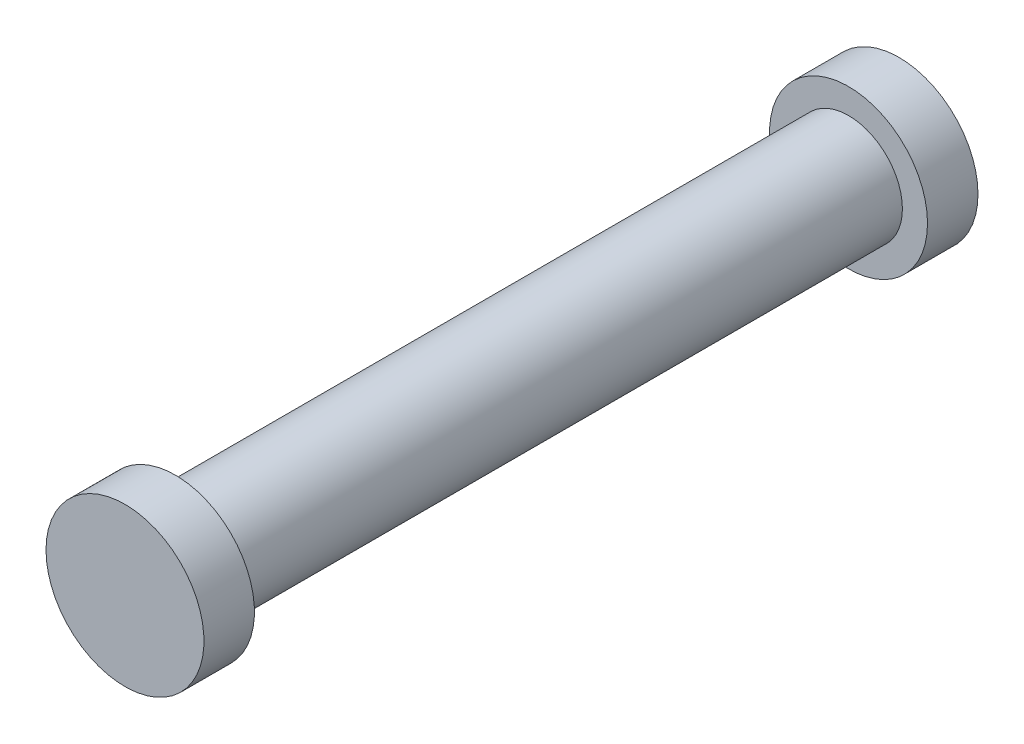
ISO-10303-21;
HEADER;
FILE_DESCRIPTION(('STEP AP214'),'2;1');
FILE_NAME('part.step','',(''),(''),'','','');
FILE_SCHEMA(('AUTOMOTIVE_DESIGN { 1 0 10303 214 1 1 1 1 }'));
ENDSEC;
DATA;
#1=APPLICATION_CONTEXT('core data for automotive mechanical design processes');
#2=APPLICATION_PROTOCOL_DEFINITION('international standard','automotive_design',2000,#1);
#3=PRODUCT_CONTEXT('',#1,'mechanical');
#4=PRODUCT('Part','Part','',(#3));
#5=PRODUCT_RELATED_PRODUCT_CATEGORY('part','',(#4));
#6=PRODUCT_DEFINITION_FORMATION('','',#4);
#7=PRODUCT_DEFINITION_CONTEXT('part definition',#1,'design');
#8=PRODUCT_DEFINITION('design','',#6,#7);
#9=PRODUCT_DEFINITION_SHAPE('','',#8);
#10=(LENGTH_UNIT() NAMED_UNIT(*) SI_UNIT(.MILLI.,.METRE.));
#11=(NAMED_UNIT(*) PLANE_ANGLE_UNIT() SI_UNIT($,.RADIAN.));
#12=(NAMED_UNIT(*) SI_UNIT($,.STERADIAN.) SOLID_ANGLE_UNIT());
#13=UNCERTAINTY_MEASURE_WITH_UNIT(LENGTH_MEASURE(1.E-05),#10,'distance_accuracy_value','');
#14=(GEOMETRIC_REPRESENTATION_CONTEXT(3) GLOBAL_UNCERTAINTY_ASSIGNED_CONTEXT((#13)) GLOBAL_UNIT_ASSIGNED_CONTEXT((#10,
#11,#12)) REPRESENTATION_CONTEXT('',''));
#15=CARTESIAN_POINT('',(0.,0.,0.));
#16=DIRECTION('',(0.,0.,1.));
#17=DIRECTION('',(1.,0.,0.));
#18=AXIS2_PLACEMENT_3D('',#15,#16,#17);
#19=CARTESIAN_POINT('',(0.,0.,50.8));
#20=DIRECTION('',(0.,0.,-1.));
#21=DIRECTION('',(-1.,0.,0.));
#22=AXIS2_PLACEMENT_3D('',#19,#20,#21);
#23=CYLINDRICAL_SURFACE('',#22,4.064);
#24=CARTESIAN_POINT('',(0.,0.,50.8));
#25=DIRECTION('',(0.,0.,1.));
#26=DIRECTION('',(1.,0.,0.));
#27=AXIS2_PLACEMENT_3D('',#24,#25,#26);
#28=CIRCLE('',#27,4.064);
#29=CARTESIAN_POINT('',(4.064,0.,50.8));
#30=VERTEX_POINT('',#29);
#31=EDGE_CURVE('E10',#30,#30,#28,.T.);
#32=ORIENTED_EDGE('',*,*,#31,.F.);
#33=EDGE_LOOP('',(#32));
#34=FACE_BOUND('',#33,.T.);
#35=CARTESIAN_POINT('',(0.,0.,0.));
#36=DIRECTION('',(0.,0.,1.));
#37=DIRECTION('',(1.,0.,0.));
#38=AXIS2_PLACEMENT_3D('',#35,#36,#37);
#39=CIRCLE('',#38,4.064);
#40=CARTESIAN_POINT('',(4.064,0.,0.));
#41=VERTEX_POINT('',#40);
#42=EDGE_CURVE('E46',#41,#41,#39,.T.);
#43=ORIENTED_EDGE('',*,*,#42,.T.);
#44=EDGE_LOOP('',(#43));
#45=FACE_BOUND('',#44,.T.);
#46=ADVANCED_FACE('F43',(#34,#45),#23,.T.);
#47=CARTESIAN_POINT('',(0.,0.,54.61));
#48=DIRECTION('',(0.,0.,-1.));
#49=DIRECTION('',(-1.,0.,0.));
#50=AXIS2_PLACEMENT_3D('',#47,#48,#49);
#51=CYLINDRICAL_SURFACE('',#50,5.96053579646076);
#52=CARTESIAN_POINT('',(0.,0.,54.61));
#53=DIRECTION('',(0.,0.,1.));
#54=DIRECTION('',(1.,0.,0.));
#55=AXIS2_PLACEMENT_3D('',#52,#53,#54);
#56=CIRCLE('',#55,5.96053579646076);
#57=CARTESIAN_POINT('',(-5.96053579646076,0.,54.61));
#58=VERTEX_POINT('',#57);
#59=EDGE_CURVE('E51',#58,#58,#56,.T.);
#60=CARTESIAN_POINT('',(0.,0.,50.8));
#61=DIRECTION('',(0.,0.,1.));
#62=DIRECTION('',(1.,0.,0.));
#63=AXIS2_PLACEMENT_3D('',#60,#61,#62);
#64=CIRCLE('',#63,5.96053579646076);
#65=CARTESIAN_POINT('',(-5.96053579646076,0.,50.8));
#66=VERTEX_POINT('',#65);
#67=EDGE_CURVE('E57',#66,#66,#64,.T.);
#68=CARTESIAN_POINT('',(-5.96053579646076,0.,54.61));
#69=CARTESIAN_POINT('',(-5.96053579646076,0.,54.5703125));
#70=CARTESIAN_POINT('',(-5.96053579646076,0.,54.530625));
#71=CARTESIAN_POINT('',(-5.96053579646076,0.,54.45125));
#72=CARTESIAN_POINT('',(-5.96053579646076,0.,54.4115625));
#73=CARTESIAN_POINT('',(-5.96053579646076,0.,54.3321875));
#74=CARTESIAN_POINT('',(-5.96053579646076,0.,54.2925));
#75=CARTESIAN_POINT('',(-5.96053579646076,0.,54.213125));
#76=CARTESIAN_POINT('',(-5.96053579646076,0.,54.1734375));
#77=CARTESIAN_POINT('',(-5.96053579646076,0.,54.0940625));
#78=CARTESIAN_POINT('',(-5.96053579646076,0.,54.054375));
#79=CARTESIAN_POINT('',(-5.96053579646076,0.,53.975));
#80=CARTESIAN_POINT('',(-5.96053579646076,0.,53.9353125));
#81=CARTESIAN_POINT('',(-5.96053579646076,0.,53.8559375));
#82=CARTESIAN_POINT('',(-5.96053579646076,0.,53.81625));
#83=CARTESIAN_POINT('',(-5.96053579646076,0.,53.736875));
#84=CARTESIAN_POINT('',(-5.96053579646076,0.,53.6971875));
#85=CARTESIAN_POINT('',(-5.96053579646076,0.,53.6178125));
#86=CARTESIAN_POINT('',(-5.96053579646076,0.,53.578125));
#87=CARTESIAN_POINT('',(-5.96053579646076,0.,53.49875));
#88=CARTESIAN_POINT('',(-5.96053579646076,0.,53.4590625));
#89=CARTESIAN_POINT('',(-5.96053579646076,0.,53.3796875));
#90=CARTESIAN_POINT('',(-5.96053579646076,0.,53.34));
#91=CARTESIAN_POINT('',(-5.96053579646076,0.,53.260625));
#92=CARTESIAN_POINT('',(-5.96053579646076,0.,53.2209375));
#93=CARTESIAN_POINT('',(-5.96053579646076,0.,53.1415625));
#94=CARTESIAN_POINT('',(-5.96053579646076,0.,53.101875));
#95=CARTESIAN_POINT('',(-5.96053579646076,0.,53.0225));
#96=CARTESIAN_POINT('',(-5.96053579646076,0.,52.9828125));
#97=CARTESIAN_POINT('',(-5.96053579646076,0.,52.9034375));
#98=CARTESIAN_POINT('',(-5.96053579646076,0.,52.86375));
#99=CARTESIAN_POINT('',(-5.96053579646076,0.,52.784375));
#100=CARTESIAN_POINT('',(-5.96053579646076,0.,52.7446875));
#101=CARTESIAN_POINT('',(-5.96053579646076,0.,52.6653125));
#102=CARTESIAN_POINT('',(-5.96053579646076,0.,52.625625));
#103=CARTESIAN_POINT('',(-5.96053579646076,0.,52.54625));
#104=CARTESIAN_POINT('',(-5.96053579646076,0.,52.5065625));
#105=CARTESIAN_POINT('',(-5.96053579646076,0.,52.4271875));
#106=CARTESIAN_POINT('',(-5.96053579646076,0.,52.3875));
#107=CARTESIAN_POINT('',(-5.96053579646076,0.,52.308125));
#108=CARTESIAN_POINT('',(-5.96053579646076,0.,52.2684375));
#109=CARTESIAN_POINT('',(-5.96053579646076,0.,52.1890625));
#110=CARTESIAN_POINT('',(-5.96053579646076,0.,52.149375));
#111=CARTESIAN_POINT('',(-5.96053579646076,0.,52.07));
#112=CARTESIAN_POINT('',(-5.96053579646076,0.,52.0303125));
#113=CARTESIAN_POINT('',(-5.96053579646076,0.,51.9509375));
#114=CARTESIAN_POINT('',(-5.96053579646076,0.,51.91125));
#115=CARTESIAN_POINT('',(-5.96053579646076,0.,51.831875));
#116=CARTESIAN_POINT('',(-5.96053579646076,0.,51.7921875));
#117=CARTESIAN_POINT('',(-5.96053579646076,0.,51.7128125));
#118=CARTESIAN_POINT('',(-5.96053579646076,0.,51.673125));
#119=CARTESIAN_POINT('',(-5.96053579646076,0.,51.59375));
#120=CARTESIAN_POINT('',(-5.96053579646076,0.,51.5540625));
#121=CARTESIAN_POINT('',(-5.96053579646076,0.,51.4746875));
#122=CARTESIAN_POINT('',(-5.96053579646076,0.,51.435));
#123=CARTESIAN_POINT('',(-5.96053579646076,0.,51.355625));
#124=CARTESIAN_POINT('',(-5.96053579646076,0.,51.3159375));
#125=CARTESIAN_POINT('',(-5.96053579646076,0.,51.2365625));
#126=CARTESIAN_POINT('',(-5.96053579646076,0.,51.196875));
#127=CARTESIAN_POINT('',(-5.96053579646076,0.,51.1175));
#128=CARTESIAN_POINT('',(-5.96053579646076,0.,51.0778125));
#129=CARTESIAN_POINT('',(-5.96053579646076,0.,50.9984375));
#130=CARTESIAN_POINT('',(-5.96053579646076,0.,50.95875));
#131=CARTESIAN_POINT('',(-5.96053579646076,0.,50.879375));
#132=CARTESIAN_POINT('',(-5.96053579646076,0.,50.8396875));
#133=CARTESIAN_POINT('',(-5.96053579646076,0.,50.8));
#134=B_SPLINE_CURVE_WITH_KNOTS('',3,(#68,#69,#70,#71,#72,#73,#74,#75,#76,#77,#78,#79,#80,#81,
#82,#83,#84,#85,#86,#87,#88,#89,#90,#91,#92,#93,#94,#95,#96,#97,#98,#99,#100,#101,#102,#103,
#104,#105,#106,#107,#108,#109,#110,#111,#112,#113,#114,#115,#116,#117,#118,#119,#120,#121,#122,
#123,#124,#125,#126,#127,#128,#129,#130,#131,#132,#133),.UNSPECIFIED.,.F.,.F.,(4,2,2,2,2,2,2,2,
2,2,2,2,2,2,2,2,2,2,2,2,2,2,2,2,2,2,2,2,2,2,2,2,4),(0.,0.119062500000003,0.238125000000006,
0.357187500000002,0.476250000000004,0.5953125,0.714375000000003,0.833437500000006,
0.952500000000002,1.0715625,1.190625,1.3096875,1.42875000000001,1.5478125,1.66687500000001,
1.7859375,1.905,2.02406250000001,2.143125,2.26218750000001,2.38125,2.5003125,2.61937500000001,
2.7384375,2.85750000000001,2.9765625,3.095625,3.21468750000001,3.33375,3.45281250000001,
3.571875,3.6909375,3.81000000000001),.UNSPECIFIED.);
#135=EDGE_CURVE('BSEAM100',#58,#66,#134,.T.);
#136=ORIENTED_EDGE('',*,*,#59,.F.);
#137=ORIENTED_EDGE('',*,*,#67,.T.);
#138=ORIENTED_EDGE('',*,*,#135,.T.);
#139=ORIENTED_EDGE('',*,*,#135,.F.);
#140=EDGE_LOOP('',(#136,#138,#137,#139));
#141=FACE_BOUND('',#140,.T.);
#142=ADVANCED_FACE('F100',(#141),#51,.T.);
#143=CARTESIAN_POINT('',(0.,0.,54.61));
#144=DIRECTION('',(0.,0.,1.));
#145=DIRECTION('',(1.,0.,0.));
#146=AXIS2_PLACEMENT_3D('',#143,#144,#145);
#147=PLANE('',#146);
#148=ORIENTED_EDGE('',*,*,#59,.T.);
#149=EDGE_LOOP('',(#148));
#150=FACE_BOUND('',#149,.T.);
#151=ADVANCED_FACE('F91',(#150),#147,.T.);
#152=CARTESIAN_POINT('',(0.,0.,50.8));
#153=DIRECTION('',(0.,0.,1.));
#154=DIRECTION('',(1.,0.,0.));
#155=AXIS2_PLACEMENT_3D('',#152,#153,#154);
#156=PLANE('',#155);
#157=ORIENTED_EDGE('',*,*,#31,.T.);
#158=EDGE_LOOP('',(#157));
#159=FACE_BOUND('',#158,.T.);
#160=ORIENTED_EDGE('',*,*,#67,.F.);
#161=EDGE_LOOP('',(#160));
#162=FACE_BOUND('',#161,.T.);
#163=ADVANCED_FACE('F83',(#159,#162),#156,.F.);
#164=CARTESIAN_POINT('',(0.,0.,-3.81));
#165=DIRECTION('',(0.,0.,1.));
#166=DIRECTION('',(1.,0.,0.));
#167=AXIS2_PLACEMENT_3D('',#164,#165,#166);
#168=CYLINDRICAL_SURFACE('',#167,5.96053579646075);
#169=CARTESIAN_POINT('',(0.,0.,-3.81));
#170=DIRECTION('',(0.,0.,-1.));
#171=DIRECTION('',(-1.,0.,0.));
#172=AXIS2_PLACEMENT_3D('',#169,#170,#171);
#173=CIRCLE('',#172,5.96053579646075);
#174=CARTESIAN_POINT('',(5.96053579646075,0.,-3.81));
#175=VERTEX_POINT('',#174);
#176=EDGE_CURVE('E67',#175,#175,#173,.T.);
#177=CARTESIAN_POINT('',(0.,0.,0.));
#178=DIRECTION('',(0.,0.,-1.));
#179=DIRECTION('',(-1.,0.,0.));
#180=AXIS2_PLACEMENT_3D('',#177,#178,#179);
#181=CIRCLE('',#180,5.96053579646075);
#182=CARTESIAN_POINT('',(5.96053579646075,0.,0.));
#183=VERTEX_POINT('',#182);
#184=EDGE_CURVE('E65',#183,#183,#181,.T.);
#185=CARTESIAN_POINT('',(5.96053579646075,0.,-3.81));
#186=CARTESIAN_POINT('',(5.96053579646075,0.,-3.7703125));
#187=CARTESIAN_POINT('',(5.96053579646075,0.,-3.730625));
#188=CARTESIAN_POINT('',(5.96053579646075,0.,-3.65125));
#189=CARTESIAN_POINT('',(5.96053579646075,0.,-3.6115625));
#190=CARTESIAN_POINT('',(5.96053579646075,0.,-3.5321875));
#191=CARTESIAN_POINT('',(5.96053579646075,0.,-3.4925));
#192=CARTESIAN_POINT('',(5.96053579646075,0.,-3.413125));
#193=CARTESIAN_POINT('',(5.96053579646075,0.,-3.3734375));
#194=CARTESIAN_POINT('',(5.96053579646075,0.,-3.2940625));
#195=CARTESIAN_POINT('',(5.96053579646075,0.,-3.254375));
#196=CARTESIAN_POINT('',(5.96053579646075,0.,-3.175));
#197=CARTESIAN_POINT('',(5.96053579646075,0.,-3.1353125));
#198=CARTESIAN_POINT('',(5.96053579646075,0.,-3.0559375));
#199=CARTESIAN_POINT('',(5.96053579646075,0.,-3.01625));
#200=CARTESIAN_POINT('',(5.96053579646075,0.,-2.936875));
#201=CARTESIAN_POINT('',(5.96053579646075,0.,-2.8971875));
#202=CARTESIAN_POINT('',(5.96053579646075,0.,-2.8178125));
#203=CARTESIAN_POINT('',(5.96053579646075,0.,-2.778125));
#204=CARTESIAN_POINT('',(5.96053579646075,0.,-2.69875));
#205=CARTESIAN_POINT('',(5.96053579646075,0.,-2.6590625));
#206=CARTESIAN_POINT('',(5.96053579646075,0.,-2.5796875));
#207=CARTESIAN_POINT('',(5.96053579646075,0.,-2.54));
#208=CARTESIAN_POINT('',(5.96053579646075,0.,-2.460625));
#209=CARTESIAN_POINT('',(5.96053579646075,0.,-2.4209375));
#210=CARTESIAN_POINT('',(5.96053579646075,0.,-2.3415625));
#211=CARTESIAN_POINT('',(5.96053579646075,0.,-2.301875));
#212=CARTESIAN_POINT('',(5.96053579646075,0.,-2.2225));
#213=CARTESIAN_POINT('',(5.96053579646075,0.,-2.1828125));
#214=CARTESIAN_POINT('',(5.96053579646075,0.,-2.1034375));
#215=CARTESIAN_POINT('',(5.96053579646075,0.,-2.06375));
#216=CARTESIAN_POINT('',(5.96053579646075,0.,-1.984375));
#217=CARTESIAN_POINT('',(5.96053579646075,0.,-1.9446875));
#218=CARTESIAN_POINT('',(5.96053579646075,0.,-1.8653125));
#219=CARTESIAN_POINT('',(5.96053579646075,0.,-1.825625));
#220=CARTESIAN_POINT('',(5.96053579646075,0.,-1.74625));
#221=CARTESIAN_POINT('',(5.96053579646075,0.,-1.7065625));
#222=CARTESIAN_POINT('',(5.96053579646075,0.,-1.6271875));
#223=CARTESIAN_POINT('',(5.96053579646075,0.,-1.5875));
#224=CARTESIAN_POINT('',(5.96053579646075,0.,-1.508125));
#225=CARTESIAN_POINT('',(5.96053579646075,0.,-1.4684375));
#226=CARTESIAN_POINT('',(5.96053579646075,0.,-1.3890625));
#227=CARTESIAN_POINT('',(5.96053579646075,0.,-1.349375));
#228=CARTESIAN_POINT('',(5.96053579646075,0.,-1.27));
#229=CARTESIAN_POINT('',(5.96053579646075,0.,-1.2303125));
#230=CARTESIAN_POINT('',(5.96053579646075,0.,-1.1509375));
#231=CARTESIAN_POINT('',(5.96053579646075,0.,-1.11125));
#232=CARTESIAN_POINT('',(5.96053579646075,0.,-1.031875));
#233=CARTESIAN_POINT('',(5.96053579646075,0.,-0.9921875));
#234=CARTESIAN_POINT('',(5.96053579646075,0.,-0.9128125));
#235=CARTESIAN_POINT('',(5.96053579646075,0.,-0.873125));
#236=CARTESIAN_POINT('',(5.96053579646075,0.,-0.79375));
#237=CARTESIAN_POINT('',(5.96053579646075,0.,-0.7540625));
#238=CARTESIAN_POINT('',(5.96053579646075,0.,-0.6746875));
#239=CARTESIAN_POINT('',(5.96053579646075,0.,-0.635));
#240=CARTESIAN_POINT('',(5.96053579646075,0.,-0.555625));
#241=CARTESIAN_POINT('',(5.96053579646075,0.,-0.5159375));
#242=CARTESIAN_POINT('',(5.96053579646075,0.,-0.4365625));
#243=CARTESIAN_POINT('',(5.96053579646075,0.,-0.396875));
#244=CARTESIAN_POINT('',(5.96053579646075,0.,-0.3175));
#245=CARTESIAN_POINT('',(5.96053579646075,0.,-0.2778125));
#246=CARTESIAN_POINT('',(5.96053579646075,0.,-0.1984375));
#247=CARTESIAN_POINT('',(5.96053579646075,0.,-0.15875));
#248=CARTESIAN_POINT('',(5.96053579646075,0.,-0.0793749999999999));
#249=CARTESIAN_POINT('',(5.96053579646075,0.,-0.0396874999999999));
#250=CARTESIAN_POINT('',(5.96053579646075,0.,0.));
#251=B_SPLINE_CURVE_WITH_KNOTS('',3,(#185,#186,#187,#188,#189,#190,#191,#192,#193,#194,#195,
#196,#197,#198,#199,#200,#201,#202,#203,#204,#205,#206,#207,#208,#209,#210,#211,#212,#213,#214,
#215,#216,#217,#218,#219,#220,#221,#222,#223,#224,#225,#226,#227,#228,#229,#230,#231,#232,#233,
#234,#235,#236,#237,#238,#239,#240,#241,#242,#243,#244,#245,#246,#247,#248,#249,#250),
.UNSPECIFIED.,.F.,.F.,(4,2,2,2,2,2,2,2,2,2,2,2,2,2,2,2,2,2,2,2,2,2,2,2,2,2,2,2,2,2,2,2,4),(0.,
0.1190625,0.238125,0.3571875,0.47625,0.5953125,0.714375,0.8334375,0.9525,1.0715625,1.190625,
1.3096875,1.42875,1.5478125,1.666875,1.7859375,1.905,2.0240625,2.143125,2.2621875,2.38125,
2.5003125,2.619375,2.7384375,2.8575,2.9765625,3.095625,3.2146875,3.33375,3.4528125,3.571875,
3.6909375,3.81),.UNSPECIFIED.);
#252=EDGE_CURVE('BSEAM84',#175,#183,#251,.T.);
#253=ORIENTED_EDGE('',*,*,#176,.F.);
#254=ORIENTED_EDGE('',*,*,#184,.T.);
#255=ORIENTED_EDGE('',*,*,#252,.T.);
#256=ORIENTED_EDGE('',*,*,#252,.F.);
#257=EDGE_LOOP('',(#253,#255,#254,#256));
#258=FACE_BOUND('',#257,.T.);
#259=ADVANCED_FACE('F84',(#258),#168,.T.);
#260=CARTESIAN_POINT('',(0.,0.,-3.81));
#261=DIRECTION('',(0.,0.,-1.));
#262=DIRECTION('',(-1.,0.,0.));
#263=AXIS2_PLACEMENT_3D('',#260,#261,#262);
#264=PLANE('',#263);
#265=ORIENTED_EDGE('',*,*,#176,.T.);
#266=EDGE_LOOP('',(#265));
#267=FACE_BOUND('',#266,.T.);
#268=ADVANCED_FACE('F76',(#267),#264,.T.);
#269=CARTESIAN_POINT('',(0.,0.,0.));
#270=DIRECTION('',(0.,0.,-1.));
#271=DIRECTION('',(-1.,0.,0.));
#272=AXIS2_PLACEMENT_3D('',#269,#270,#271);
#273=PLANE('',#272);
#274=ORIENTED_EDGE('',*,*,#42,.F.);
#275=EDGE_LOOP('',(#274));
#276=FACE_BOUND('',#275,.T.);
#277=ORIENTED_EDGE('',*,*,#184,.F.);
#278=EDGE_LOOP('',(#277));
#279=FACE_BOUND('',#278,.T.);
#280=ADVANCED_FACE('F77',(#276,#279),#273,.F.);
#281=CLOSED_SHELL('',(#46,#142,#151,#163,#259,#268,#280));
#282=MANIFOLD_SOLID_BREP('B2',#281);
#283=ADVANCED_BREP_SHAPE_REPRESENTATION('',(#18,#282),#14);
#284=SHAPE_DEFINITION_REPRESENTATION(#9,#283);
ENDSEC;
END-ISO-10303-21;
